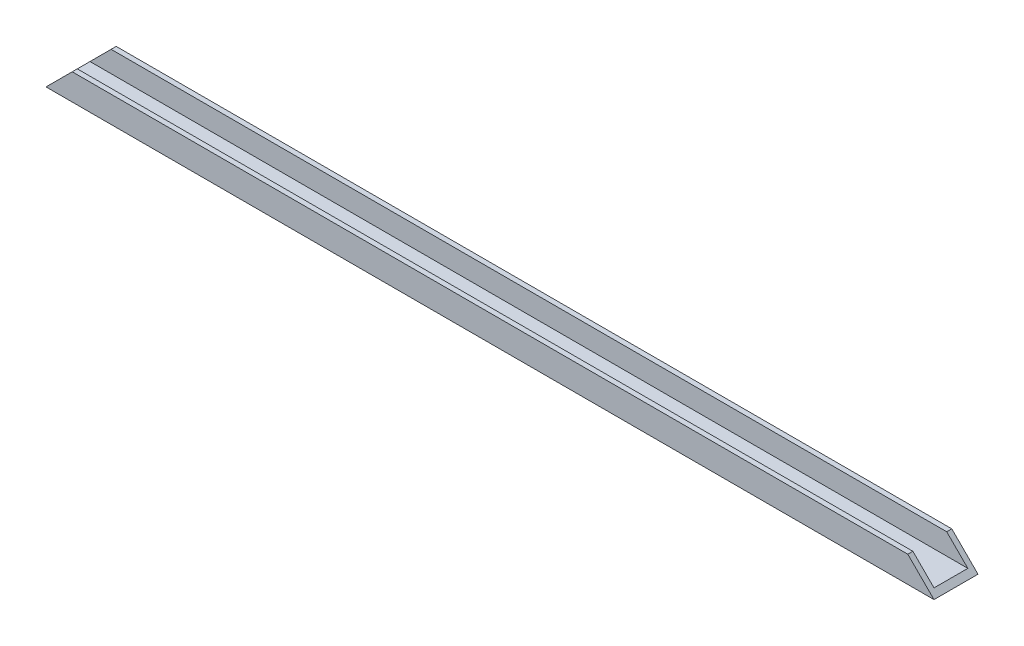
ISO-10303-21;
HEADER;
FILE_DESCRIPTION(('STEP AP214'),'2;1');
FILE_NAME('part.step','',(''),(''),'','','');
FILE_SCHEMA(('AUTOMOTIVE_DESIGN { 1 0 10303 214 1 1 1 1 }'));
ENDSEC;
DATA;
#1=APPLICATION_CONTEXT('core data for automotive mechanical design processes');
#2=APPLICATION_PROTOCOL_DEFINITION('international standard','automotive_design',2000,#1);
#3=PRODUCT_CONTEXT('',#1,'mechanical');
#4=PRODUCT('Part','Part','',(#3));
#5=PRODUCT_RELATED_PRODUCT_CATEGORY('part','',(#4));
#6=PRODUCT_DEFINITION_FORMATION('','',#4);
#7=PRODUCT_DEFINITION_CONTEXT('part definition',#1,'design');
#8=PRODUCT_DEFINITION('design','',#6,#7);
#9=PRODUCT_DEFINITION_SHAPE('','',#8);
#10=(LENGTH_UNIT() NAMED_UNIT(*) SI_UNIT(.MILLI.,.METRE.));
#11=(NAMED_UNIT(*) PLANE_ANGLE_UNIT() SI_UNIT($,.RADIAN.));
#12=(NAMED_UNIT(*) SI_UNIT($,.STERADIAN.) SOLID_ANGLE_UNIT());
#13=UNCERTAINTY_MEASURE_WITH_UNIT(LENGTH_MEASURE(1.E-05),#10,'distance_accuracy_value','');
#14=(GEOMETRIC_REPRESENTATION_CONTEXT(3) GLOBAL_UNCERTAINTY_ASSIGNED_CONTEXT((#13)) GLOBAL_UNIT_ASSIGNED_CONTEXT((#10,
#11,#12)) REPRESENTATION_CONTEXT('',''));
#15=CARTESIAN_POINT('',(0.,0.,0.));
#16=DIRECTION('',(0.,0.,1.));
#17=DIRECTION('',(1.,0.,0.));
#18=AXIS2_PLACEMENT_3D('',#15,#16,#17);
#19=CARTESIAN_POINT('',(105.,5.,5.2));
#20=DIRECTION('',(0.,-1.,0.));
#21=DIRECTION('',(0.,0.,-1.));
#22=AXIS2_PLACEMENT_3D('',#19,#20,#21);
#23=PLANE('',#22);
#24=DIRECTION('',(-1.,0.,0.));
#25=VECTOR('',#24,1.);
#26=CARTESIAN_POINT('',(105.,5.,4.));
#27=LINE('',#26,#25);
#28=CARTESIAN_POINT('',(98.8000000000001,5.00000000000002,4.));
#29=VERTEX_POINT('',#28);
#30=CARTESIAN_POINT('',(-98.8000000000001,5.,4.));
#31=VERTEX_POINT('',#30);
#32=EDGE_CURVE('E189',#29,#31,#27,.T.);
#33=ORIENTED_EDGE('',*,*,#32,.T.);
#34=DIRECTION('',(0.,0.,1.));
#35=VECTOR('',#34,1.);
#36=CARTESIAN_POINT('',(-98.8000000000001,5.,-5.2));
#37=LINE('',#36,#35);
#38=CARTESIAN_POINT('',(-98.8000000000001,5.,5.2));
#39=VERTEX_POINT('',#38);
#40=EDGE_CURVE('E118',#31,#39,#37,.T.);
#41=ORIENTED_EDGE('',*,*,#40,.T.);
#42=DIRECTION('',(-1.,0.,0.));
#43=VECTOR('',#42,1.);
#44=CARTESIAN_POINT('',(105.,5.,5.2));
#45=LINE('',#44,#43);
#46=CARTESIAN_POINT('',(98.8000000000001,5.00000000000002,5.2));
#47=VERTEX_POINT('',#46);
#48=EDGE_CURVE('E11',#47,#39,#45,.T.);
#49=ORIENTED_EDGE('',*,*,#48,.F.);
#50=DIRECTION('',(0.,0.,1.));
#51=VECTOR('',#50,1.);
#52=CARTESIAN_POINT('',(98.8000000000001,5.00000000000002,-5.2));
#53=LINE('',#52,#51);
#54=EDGE_CURVE('E162',#29,#47,#53,.T.);
#55=ORIENTED_EDGE('',*,*,#54,.F.);
#56=EDGE_LOOP('',(#33,#41,#49,#55));
#57=FACE_BOUND('',#56,.T.);
#58=ADVANCED_FACE('F45',(#57),#23,.F.);
#59=CARTESIAN_POINT('',(105.,5.,5.2));
#60=DIRECTION('',(0.,0.,-1.));
#61=DIRECTION('',(0.,1.,0.));
#62=AXIS2_PLACEMENT_3D('',#59,#60,#61);
#63=PLANE('',#62);
#64=ORIENTED_EDGE('',*,*,#48,.T.);
#65=DIRECTION('',(0.707106781186542,0.707106781186553,0.));
#66=VECTOR('',#65,1.);
#67=CARTESIAN_POINT('',(-105.,-1.2,5.2));
#68=LINE('',#67,#66);
#69=CARTESIAN_POINT('',(-105.,-1.2,5.2));
#70=VERTEX_POINT('',#69);
#71=EDGE_CURVE('E129',#70,#39,#68,.T.);
#72=ORIENTED_EDGE('',*,*,#71,.F.);
#73=DIRECTION('',(-1.,0.,0.));
#74=VECTOR('',#73,1.);
#75=CARTESIAN_POINT('',(105.,-1.2,5.2));
#76=LINE('',#75,#74);
#77=CARTESIAN_POINT('',(105.,-1.2,5.2));
#78=VERTEX_POINT('',#77);
#79=EDGE_CURVE('E54',#78,#70,#76,.T.);
#80=ORIENTED_EDGE('',*,*,#79,.F.);
#81=DIRECTION('',(0.707106781186542,-0.707106781186553,0.));
#82=VECTOR('',#81,1.);
#83=CARTESIAN_POINT('',(105.,-1.19999999999997,5.2));
#84=LINE('',#83,#82);
#85=EDGE_CURVE('E60',#47,#78,#84,.T.);
#86=ORIENTED_EDGE('',*,*,#85,.F.);
#87=EDGE_LOOP('',(#64,#72,#80,#86));
#88=FACE_BOUND('',#87,.T.);
#89=ADVANCED_FACE('F152',(#88),#63,.F.);
#90=CARTESIAN_POINT('',(105.,-1.2,5.2));
#91=DIRECTION('',(0.,1.,0.));
#92=DIRECTION('',(0.,0.,1.));
#93=AXIS2_PLACEMENT_3D('',#90,#91,#92);
#94=PLANE('',#93);
#95=DIRECTION('',(0.,0.,-1.));
#96=VECTOR('',#95,1.);
#97=CARTESIAN_POINT('',(-105.,-1.2,5.2));
#98=LINE('',#97,#96);
#99=CARTESIAN_POINT('',(-105.,-1.2,-5.2));
#100=VERTEX_POINT('',#99);
#101=EDGE_CURVE('E148',#70,#100,#98,.T.);
#102=ORIENTED_EDGE('',*,*,#101,.T.);
#103=DIRECTION('',(-1.,0.,0.));
#104=VECTOR('',#103,1.);
#105=CARTESIAN_POINT('',(105.,-1.2,-5.2));
#106=LINE('',#105,#104);
#107=CARTESIAN_POINT('',(105.,-1.19999999999997,-5.2));
#108=VERTEX_POINT('',#107);
#109=EDGE_CURVE('E127',#108,#100,#106,.T.);
#110=ORIENTED_EDGE('',*,*,#109,.F.);
#111=DIRECTION('',(0.,0.,-1.));
#112=VECTOR('',#111,1.);
#113=CARTESIAN_POINT('',(105.,-1.2,5.2));
#114=LINE('',#113,#112);
#115=EDGE_CURVE('E149',#78,#108,#114,.T.);
#116=ORIENTED_EDGE('',*,*,#115,.F.);
#117=ORIENTED_EDGE('',*,*,#79,.T.);
#118=EDGE_LOOP('',(#102,#110,#116,#117));
#119=FACE_BOUND('',#118,.T.);
#120=ADVANCED_FACE('F147',(#119),#94,.F.);
#121=CARTESIAN_POINT('',(105.,-1.2,-5.2));
#122=DIRECTION('',(0.,0.,1.));
#123=DIRECTION('',(1.,0.,0.));
#124=AXIS2_PLACEMENT_3D('',#121,#122,#123);
#125=PLANE('',#124);
#126=ORIENTED_EDGE('',*,*,#109,.T.);
#127=DIRECTION('',(0.707106781186542,0.707106781186553,0.));
#128=VECTOR('',#127,1.);
#129=CARTESIAN_POINT('',(-105.,-1.2,-5.2));
#130=LINE('',#129,#128);
#131=CARTESIAN_POINT('',(-98.8000000000001,5.,-5.2));
#132=VERTEX_POINT('',#131);
#133=EDGE_CURVE('E108',#100,#132,#130,.T.);
#134=ORIENTED_EDGE('',*,*,#133,.T.);
#135=DIRECTION('',(-1.,0.,0.));
#136=VECTOR('',#135,1.);
#137=CARTESIAN_POINT('',(105.,5.,-5.2));
#138=LINE('',#137,#136);
#139=CARTESIAN_POINT('',(98.8000000000001,5.00000000000002,-5.2));
#140=VERTEX_POINT('',#139);
#141=EDGE_CURVE('E125',#140,#132,#138,.T.);
#142=ORIENTED_EDGE('',*,*,#141,.F.);
#143=DIRECTION('',(0.707106781186542,-0.707106781186553,0.));
#144=VECTOR('',#143,1.);
#145=CARTESIAN_POINT('',(105.,-1.19999999999997,-5.2));
#146=LINE('',#145,#144);
#147=EDGE_CURVE('E158',#140,#108,#146,.T.);
#148=ORIENTED_EDGE('',*,*,#147,.T.);
#149=EDGE_LOOP('',(#126,#134,#142,#148));
#150=FACE_BOUND('',#149,.T.);
#151=ADVANCED_FACE('F123',(#150),#125,.F.);
#152=CARTESIAN_POINT('',(105.,5.,-4.));
#153=DIRECTION('',(0.,-1.,0.));
#154=DIRECTION('',(0.,0.,-1.));
#155=AXIS2_PLACEMENT_3D('',#152,#153,#154);
#156=PLANE('',#155);
#157=ORIENTED_EDGE('',*,*,#141,.T.);
#158=CARTESIAN_POINT('',(-98.8000000000001,5.,-4.));
#159=VERTEX_POINT('',#158);
#160=EDGE_CURVE('E105',#132,#159,#37,.T.);
#161=ORIENTED_EDGE('',*,*,#160,.T.);
#162=DIRECTION('',(-1.,0.,0.));
#163=VECTOR('',#162,1.);
#164=CARTESIAN_POINT('',(105.,5.,-4.));
#165=LINE('',#164,#163);
#166=CARTESIAN_POINT('',(98.8000000000001,5.00000000000002,-4.));
#167=VERTEX_POINT('',#166);
#168=EDGE_CURVE('E135',#167,#159,#165,.T.);
#169=ORIENTED_EDGE('',*,*,#168,.F.);
#170=EDGE_CURVE('E133',#140,#167,#53,.T.);
#171=ORIENTED_EDGE('',*,*,#170,.F.);
#172=EDGE_LOOP('',(#157,#161,#169,#171));
#173=FACE_BOUND('',#172,.T.);
#174=ADVANCED_FACE('F132',(#173),#156,.F.);
#175=CARTESIAN_POINT('',(105.,0.,-4.));
#176=DIRECTION('',(0.,0.,-1.));
#177=DIRECTION('',(-1.,0.,0.));
#178=AXIS2_PLACEMENT_3D('',#175,#176,#177);
#179=PLANE('',#178);
#180=ORIENTED_EDGE('',*,*,#168,.T.);
#181=DIRECTION('',(-0.707106781186542,-0.707106781186553,0.));
#182=VECTOR('',#181,1.);
#183=CARTESIAN_POINT('',(0.599999999998282,104.4,-4.));
#184=LINE('',#183,#182);
#185=CARTESIAN_POINT('',(-103.8,0.,-4.));
#186=VERTEX_POINT('',#185);
#187=EDGE_CURVE('E111',#159,#186,#184,.T.);
#188=ORIENTED_EDGE('',*,*,#187,.T.);
#189=DIRECTION('',(-1.,0.,0.));
#190=VECTOR('',#189,1.);
#191=CARTESIAN_POINT('',(105.,0.,-4.));
#192=LINE('',#191,#190);
#193=CARTESIAN_POINT('',(103.8,0.,-4.));
#194=VERTEX_POINT('',#193);
#195=EDGE_CURVE('E140',#194,#186,#192,.T.);
#196=ORIENTED_EDGE('',*,*,#195,.F.);
#197=DIRECTION('',(-0.707106781186542,0.707106781186553,0.));
#198=VECTOR('',#197,1.);
#199=CARTESIAN_POINT('',(104.4,-0.599999999999977,-4.));
#200=LINE('',#199,#198);
#201=EDGE_CURVE('E183',#194,#167,#200,.T.);
#202=ORIENTED_EDGE('',*,*,#201,.T.);
#203=EDGE_LOOP('',(#180,#188,#196,#202));
#204=FACE_BOUND('',#203,.T.);
#205=ADVANCED_FACE('F205',(#204),#179,.F.);
#206=CARTESIAN_POINT('',(105.,0.,4.));
#207=DIRECTION('',(0.,-1.,0.));
#208=DIRECTION('',(0.,0.,-1.));
#209=AXIS2_PLACEMENT_3D('',#206,#207,#208);
#210=PLANE('',#209);
#211=ORIENTED_EDGE('',*,*,#195,.T.);
#212=DIRECTION('',(0.,0.,1.));
#213=VECTOR('',#212,1.);
#214=CARTESIAN_POINT('',(-103.8,0.,3.99999999999996));
#215=LINE('',#214,#213);
#216=CARTESIAN_POINT('',(-103.8,0.,4.));
#217=VERTEX_POINT('',#216);
#218=EDGE_CURVE('E169',#186,#217,#215,.T.);
#219=ORIENTED_EDGE('',*,*,#218,.T.);
#220=DIRECTION('',(-1.,0.,0.));
#221=VECTOR('',#220,1.);
#222=CARTESIAN_POINT('',(105.,0.,4.));
#223=LINE('',#222,#221);
#224=CARTESIAN_POINT('',(103.8,0.,4.));
#225=VERTEX_POINT('',#224);
#226=EDGE_CURVE('E195',#225,#217,#223,.T.);
#227=ORIENTED_EDGE('',*,*,#226,.F.);
#228=DIRECTION('',(0.,0.,-1.));
#229=VECTOR('',#228,1.);
#230=CARTESIAN_POINT('',(103.8,0.,4.));
#231=LINE('',#230,#229);
#232=EDGE_CURVE('E179',#225,#194,#231,.T.);
#233=ORIENTED_EDGE('',*,*,#232,.T.);
#234=EDGE_LOOP('',(#211,#219,#227,#233));
#235=FACE_BOUND('',#234,.T.);
#236=ADVANCED_FACE('F202',(#235),#210,.F.);
#237=CARTESIAN_POINT('',(105.,5.,4.));
#238=DIRECTION('',(0.,0.,1.));
#239=DIRECTION('',(1.,0.,0.));
#240=AXIS2_PLACEMENT_3D('',#237,#238,#239);
#241=PLANE('',#240);
#242=ORIENTED_EDGE('',*,*,#226,.T.);
#243=DIRECTION('',(0.707106781186542,0.707106781186553,0.));
#244=VECTOR('',#243,1.);
#245=CARTESIAN_POINT('',(3.09999999999828,106.9,4.));
#246=LINE('',#245,#244);
#247=EDGE_CURVE('E117',#217,#31,#246,.T.);
#248=ORIENTED_EDGE('',*,*,#247,.T.);
#249=ORIENTED_EDGE('',*,*,#32,.F.);
#250=DIRECTION('',(0.707106781186542,-0.707106781186553,0.));
#251=VECTOR('',#250,1.);
#252=CARTESIAN_POINT('',(101.9,1.90000000000006,4.));
#253=LINE('',#252,#251);
#254=EDGE_CURVE('E175',#29,#225,#253,.T.);
#255=ORIENTED_EDGE('',*,*,#254,.T.);
#256=EDGE_LOOP('',(#242,#248,#249,#255));
#257=FACE_BOUND('',#256,.T.);
#258=ADVANCED_FACE('F210',(#257),#241,.F.);
#259=CARTESIAN_POINT('',(-105.,-1.2,-5.2));
#260=DIRECTION('',(0.707106781186553,-0.707106781186542,0.));
#261=DIRECTION('',(0.707106781186542,0.707106781186553,0.));
#262=AXIS2_PLACEMENT_3D('',#259,#260,#261);
#263=PLANE('',#262);
#264=ORIENTED_EDGE('',*,*,#160,.F.);
#265=ORIENTED_EDGE('',*,*,#133,.F.);
#266=ORIENTED_EDGE('',*,*,#101,.F.);
#267=ORIENTED_EDGE('',*,*,#71,.T.);
#268=ORIENTED_EDGE('',*,*,#40,.F.);
#269=ORIENTED_EDGE('',*,*,#247,.F.);
#270=ORIENTED_EDGE('',*,*,#218,.F.);
#271=ORIENTED_EDGE('',*,*,#187,.F.);
#272=EDGE_LOOP('',(#264,#265,#266,#267,#268,#269,#270,#271));
#273=FACE_BOUND('',#272,.T.);
#274=ADVANCED_FACE('F107',(#273),#263,.F.);
#275=CARTESIAN_POINT('',(105.,-1.19999999999997,-5.2));
#276=DIRECTION('',(-0.707106781186553,-0.707106781186542,0.));
#277=DIRECTION('',(0.707106781186542,-0.707106781186553,0.));
#278=AXIS2_PLACEMENT_3D('',#275,#276,#277);
#279=PLANE('',#278);
#280=ORIENTED_EDGE('',*,*,#232,.F.);
#281=ORIENTED_EDGE('',*,*,#254,.F.);
#282=ORIENTED_EDGE('',*,*,#54,.T.);
#283=ORIENTED_EDGE('',*,*,#85,.T.);
#284=ORIENTED_EDGE('',*,*,#115,.T.);
#285=ORIENTED_EDGE('',*,*,#147,.F.);
#286=ORIENTED_EDGE('',*,*,#170,.T.);
#287=ORIENTED_EDGE('',*,*,#201,.F.);
#288=EDGE_LOOP('',(#280,#281,#282,#283,#284,#285,#286,#287));
#289=FACE_BOUND('',#288,.T.);
#290=ADVANCED_FACE('F206',(#289),#279,.F.);
#291=CLOSED_SHELL('',(#58,#89,#120,#151,#174,#205,#236,#258,#274,#290));
#292=MANIFOLD_SOLID_BREP('B2',#291);
#293=ADVANCED_BREP_SHAPE_REPRESENTATION('',(#18,#292),#14);
#294=SHAPE_DEFINITION_REPRESENTATION(#9,#293);
ENDSEC;
END-ISO-10303-21;
